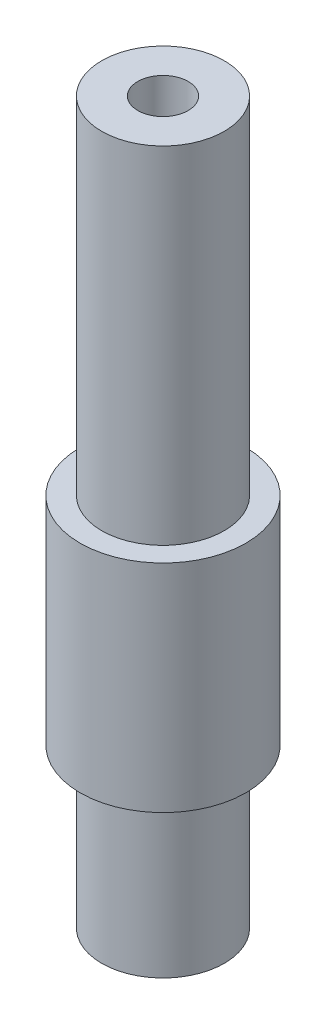
ISO-10303-21;
HEADER;
FILE_DESCRIPTION(('STEP AP214'),'2;1');
FILE_NAME('part.step','',(''),(''),'','','');
FILE_SCHEMA(('AUTOMOTIVE_DESIGN { 1 0 10303 214 1 1 1 1 }'));
ENDSEC;
DATA;
#1=APPLICATION_CONTEXT('core data for automotive mechanical design processes');
#2=APPLICATION_PROTOCOL_DEFINITION('international standard','automotive_design',2000,#1);
#3=PRODUCT_CONTEXT('',#1,'mechanical');
#4=PRODUCT('Part','Part','',(#3));
#5=PRODUCT_RELATED_PRODUCT_CATEGORY('part','',(#4));
#6=PRODUCT_DEFINITION_FORMATION('','',#4);
#7=PRODUCT_DEFINITION_CONTEXT('part definition',#1,'design');
#8=PRODUCT_DEFINITION('design','',#6,#7);
#9=PRODUCT_DEFINITION_SHAPE('','',#8);
#10=(LENGTH_UNIT() NAMED_UNIT(*) SI_UNIT(.MILLI.,.METRE.));
#11=(NAMED_UNIT(*) PLANE_ANGLE_UNIT() SI_UNIT($,.RADIAN.));
#12=(NAMED_UNIT(*) SI_UNIT($,.STERADIAN.) SOLID_ANGLE_UNIT());
#13=UNCERTAINTY_MEASURE_WITH_UNIT(LENGTH_MEASURE(1.E-05),#10,'distance_accuracy_value','');
#14=(GEOMETRIC_REPRESENTATION_CONTEXT(3) GLOBAL_UNCERTAINTY_ASSIGNED_CONTEXT((#13)) GLOBAL_UNIT_ASSIGNED_CONTEXT((#10,
#11,#12)) REPRESENTATION_CONTEXT('',''));
#15=CARTESIAN_POINT('',(0.,0.,0.));
#16=DIRECTION('',(0.,0.,1.));
#17=DIRECTION('',(1.,0.,0.));
#18=AXIS2_PLACEMENT_3D('',#15,#16,#17);
#19=CARTESIAN_POINT('',(0.,22.,0.));
#20=DIRECTION('',(0.,-1.,0.));
#21=DIRECTION('',(0.,0.,-1.));
#22=AXIS2_PLACEMENT_3D('',#19,#20,#21);
#23=CYLINDRICAL_SURFACE('',#22,8.5);
#24=DIRECTION('',(0.,-1.,0.));
#25=VECTOR('',#24,1.);
#26=CARTESIAN_POINT('',(-8.12403840463596,22.,-2.5));
#27=LINE('',#26,#25);
#28=CARTESIAN_POINT('',(-8.12403840463596,4.5,-2.5));
#29=VERTEX_POINT('',#28);
#30=CARTESIAN_POINT('',(-8.12403840463596,17.5,-2.5));
#31=VERTEX_POINT('',#30);
#32=EDGE_CURVE('E197',#29,#31,#27,.F.);
#33=ORIENTED_EDGE('',*,*,#32,.T.);
#34=CARTESIAN_POINT('',(-8.12403840463596,17.5,-2.5));
#35=CARTESIAN_POINT('',(-8.12402906918787,17.5686798740165,-2.50000849482375));
#36=CARTESIAN_POINT('',(-8.12490911076693,17.6373543550343,-2.49717000278527));
#37=CARTESIAN_POINT('',(-8.12837858671625,17.7741805441501,-2.48586511968106));
#38=CARTESIAN_POINT('',(-8.13096764928694,17.8423323626925,-2.47739995270244));
#39=CARTESIAN_POINT('',(-8.13777747849977,17.9774651852461,-2.4549353972169));
#40=CARTESIAN_POINT('',(-8.14199421689239,18.0444486563169,-2.44094966934028));
#41=CARTESIAN_POINT('',(-8.15192355487623,18.1769261224907,-2.40758038109888));
#42=CARTESIAN_POINT('',(-8.15763619117327,18.2424200810019,-2.38819668828));
#43=CARTESIAN_POINT('',(-8.17677139859334,18.4359466577163,-2.32218333516284));
#44=CARTESIAN_POINT('',(-8.19220032894025,18.5611911443731,-2.26766331260792));
#45=CARTESIAN_POINT('',(-8.22665400749432,18.8007525002289,-2.13928827038699));
#46=CARTESIAN_POINT('',(-8.24568033865688,18.9150645253734,-2.06542473351158));
#47=CARTESIAN_POINT('',(-8.28582980304436,19.1330227536414,-1.89805567552886));
#48=CARTESIAN_POINT('',(-8.30699606932741,19.2362914557573,-1.80406793699746));
#49=CARTESIAN_POINT('',(-8.3486723067775,19.4258512308676,-1.60015164255654));
#50=CARTESIAN_POINT('',(-8.36918216745792,19.5121394581522,-1.49022042007659));
#51=CARTESIAN_POINT('',(-8.40772509439061,19.6669298144631,-1.25484557022574));
#52=CARTESIAN_POINT('',(-8.4257010652051,19.735045858621,-1.12913784642324));
#53=CARTESIAN_POINT('',(-8.45664705558546,19.8490219915755,-0.867439712870043));
#54=CARTESIAN_POINT('',(-8.46961832661638,19.8948876449987,-0.731451883926505));
#55=CARTESIAN_POINT('',(-8.48878775104764,19.9618125975809,-0.457025436042512));
#56=CARTESIAN_POINT('',(-8.49516267663223,19.9835205659233,-0.318757581047491));
#57=CARTESIAN_POINT('',(-8.50104290465192,20.0035631669422,-0.0404023337326088));
#58=CARTESIAN_POINT('',(-8.50054945212903,20.0019020357725,0.0996847242177954));
#59=CARTESIAN_POINT('',(-8.49287404903277,19.9756920726157,0.373152065700694));
#60=CARTESIAN_POINT('',(-8.48589741931878,19.9518458124474,0.506606351501283));
#61=CARTESIAN_POINT('',(-8.46628787386658,19.8830881283723,0.767526211609395));
#62=CARTESIAN_POINT('',(-8.45365466599277,19.8381756164872,0.894991476236478));
#63=CARTESIAN_POINT('',(-8.42386367197651,19.7280728830861,1.14201050505989));
#64=CARTESIAN_POINT('',(-8.40665607251673,19.6626579008713,1.26145783196648));
#65=CARTESIAN_POINT('',(-8.36954730631605,19.5135844050676,1.48790576816497));
#66=CARTESIAN_POINT('',(-8.34964555974157,19.4299219618899,1.59490368885599));
#67=CARTESIAN_POINT('',(-8.3084133766687,19.2430791868332,1.79760092163622));
#68=CARTESIAN_POINT('',(-8.28705732485783,19.1392910095942,1.89273539157048));
#69=CARTESIAN_POINT('',(-8.24596689824959,18.9169959430954,2.06442395091056));
#70=CARTESIAN_POINT('',(-8.22623299169098,18.798484828619,2.14097268784054));
#71=CARTESIAN_POINT('',(-8.19049726651393,18.5486482102345,2.27388499803613));
#72=CARTESIAN_POINT('',(-8.17453234339792,18.4172125416657,2.33005169701786));
#73=CARTESIAN_POINT('',(-8.14859211524143,18.1462427316992,2.41922275200857));
#74=CARTESIAN_POINT('',(-8.13860768891974,18.0067212808269,2.45226239378342));
#75=CARTESIAN_POINT('',(-8.1295316440969,17.8049224206918,2.48209216527632));
#76=CARTESIAN_POINT('',(-8.12747604590249,17.7441046608776,2.48880708529662));
#77=CARTESIAN_POINT('',(-8.12472934803225,17.6222014669268,2.49775684694221));
#78=CARTESIAN_POINT('',(-8.1240362093203,17.5611165701191,2.49999838344215));
#79=CARTESIAN_POINT('',(-8.12403840463596,17.5,2.5));
#80=B_SPLINE_CURVE_WITH_KNOTS('',3,(#34,#35,#36,#37,#38,#39,#40,#41,#42,#43,#44,#45,#46,#47,#48,
#49,#50,#51,#52,#53,#54,#55,#56,#57,#58,#59,#60,#61,#62,#63,#64,#65,#66,#67,#68,#69,#70,#71,#72,
#73,#74,#75,#76,#77,#78,#79),.UNSPECIFIED.,.F.,.F.,(4,2,2,2,2,2,2,2,2,2,2,2,2,2,2,2,2,2,2,2,2,2,
4),(0.,0.205966154303657,0.411887515184553,0.617302486138776,0.822722497965398,1.23305966556147,
1.64357781480005,2.06533049675579,2.48715379896952,2.91733102657663,3.3474006151165,
3.76562050724646,4.18376458896796,4.58910158908382,4.99445952536039,5.40442657694558,
5.81448200221468,6.23971616695719,6.66507264934228,7.09443475825321,7.52314033790764,
7.70665727258006,7.88989934885715),.UNSPECIFIED.);
#81=CARTESIAN_POINT('',(-8.12403840463596,17.5,2.5));
#82=VERTEX_POINT('',#81);
#83=EDGE_CURVE('E217',#31,#82,#80,.T.);
#84=ORIENTED_EDGE('',*,*,#83,.T.);
#85=DIRECTION('',(0.,-1.,0.));
#86=VECTOR('',#85,1.);
#87=CARTESIAN_POINT('',(-8.12403840463596,22.,2.5));
#88=LINE('',#87,#86);
#89=CARTESIAN_POINT('',(-8.12403840463596,4.5,2.5));
#90=VERTEX_POINT('',#89);
#91=EDGE_CURVE('E175',#82,#90,#88,.T.);
#92=ORIENTED_EDGE('',*,*,#91,.T.);
#93=CARTESIAN_POINT('',(-8.12403840463596,4.5,2.5));
#94=CARTESIAN_POINT('',(-8.12402906918787,4.43132012598351,2.50000849482375));
#95=CARTESIAN_POINT('',(-8.12490911076693,4.36264564496574,2.49717000278527));
#96=CARTESIAN_POINT('',(-8.12837858671625,4.22581945584985,2.48586511968106));
#97=CARTESIAN_POINT('',(-8.13096764928694,4.15766763730745,2.47739995270243));
#98=CARTESIAN_POINT('',(-8.13777747849977,4.02253481475384,2.4549353972169));
#99=CARTESIAN_POINT('',(-8.14199421689239,3.95555134368311,2.44094966934028));
#100=CARTESIAN_POINT('',(-8.15192355487623,3.82307387750925,2.40758038109888));
#101=CARTESIAN_POINT('',(-8.15763619117327,3.75757991899812,2.38819668828));
#102=CARTESIAN_POINT('',(-8.17677139859334,3.56405334228369,2.32218333516283));
#103=CARTESIAN_POINT('',(-8.19220032894026,3.43880885562689,2.26766331260791));
#104=CARTESIAN_POINT('',(-8.22665400749432,3.19924749977114,2.13928827038699));
#105=CARTESIAN_POINT('',(-8.24568033865688,3.08493547462655,2.06542473351158));
#106=CARTESIAN_POINT('',(-8.28582980304436,2.86697724635863,1.89805567552886));
#107=CARTESIAN_POINT('',(-8.30699606932741,2.76370854424266,1.80406793699746));
#108=CARTESIAN_POINT('',(-8.3486723067775,2.57414876913239,1.60015164255654));
#109=CARTESIAN_POINT('',(-8.36918216745792,2.4878605418478,1.49022042007658));
#110=CARTESIAN_POINT('',(-8.40772509439061,2.33307018553694,1.25484557022573));
#111=CARTESIAN_POINT('',(-8.4257010652051,2.26495414137895,1.12913784642324));
#112=CARTESIAN_POINT('',(-8.45664705558546,2.15097800842445,0.867439712870039));
#113=CARTESIAN_POINT('',(-8.46961832661638,2.10511235500126,0.731451883926502));
#114=CARTESIAN_POINT('',(-8.48878775104765,2.03818740241911,0.45702543604251));
#115=CARTESIAN_POINT('',(-8.49516267663223,2.01647943407666,0.318757581047488));
#116=CARTESIAN_POINT('',(-8.50104290465192,1.99643683305777,0.040402333732606));
#117=CARTESIAN_POINT('',(-8.50054945212903,1.99809796422748,-0.0996847242177983));
#118=CARTESIAN_POINT('',(-8.49287404903277,2.02430792738427,-0.373152065700697));
#119=CARTESIAN_POINT('',(-8.48589741931878,2.04815418755256,-0.506606351501286));
#120=CARTESIAN_POINT('',(-8.46628787386658,2.11691187162767,-0.767526211609398));
#121=CARTESIAN_POINT('',(-8.45365466599277,2.1618243835128,-0.894991476236481));
#122=CARTESIAN_POINT('',(-8.42386367197651,2.2719271169139,-1.14201050505989));
#123=CARTESIAN_POINT('',(-8.40665607251673,2.33734209912869,-1.26145783196649));
#124=CARTESIAN_POINT('',(-8.36954730631605,2.48641559493242,-1.48790576816497));
#125=CARTESIAN_POINT('',(-8.34964555974157,2.57007803811012,-1.59490368885599));
#126=CARTESIAN_POINT('',(-8.3084133766687,2.75692081316677,-1.79760092163623));
#127=CARTESIAN_POINT('',(-8.28705732485783,2.86070899040578,-1.89273539157049));
#128=CARTESIAN_POINT('',(-8.24596689824959,3.08300405690464,-2.06442395091057));
#129=CARTESIAN_POINT('',(-8.22623299169098,3.20151517138103,-2.14097268784054));
#130=CARTESIAN_POINT('',(-8.19049726651393,3.45135178976552,-2.27388499803613));
#131=CARTESIAN_POINT('',(-8.17453234339792,3.5827874583343,-2.33005169701786));
#132=CARTESIAN_POINT('',(-8.14859211524143,3.85375726830082,-2.41922275200858));
#133=CARTESIAN_POINT('',(-8.13860768891974,3.99327871917307,-2.45226239378342));
#134=CARTESIAN_POINT('',(-8.1295316440969,4.19507757930823,-2.48209216527632));
#135=CARTESIAN_POINT('',(-8.12747604590249,4.25589533912244,-2.48880708529662));
#136=CARTESIAN_POINT('',(-8.12472934803225,4.37779853307323,-2.49775684694221));
#137=CARTESIAN_POINT('',(-8.1240362093203,4.43888342988087,-2.49999838344215));
#138=CARTESIAN_POINT('',(-8.12403840463596,4.5,-2.5));
#139=B_SPLINE_CURVE_WITH_KNOTS('',3,(#93,#94,#95,#96,#97,#98,#99,#100,#101,#102,#103,#104,#105,
#106,#107,#108,#109,#110,#111,#112,#113,#114,#115,#116,#117,#118,#119,#120,#121,#122,#123,#124,
#125,#126,#127,#128,#129,#130,#131,#132,#133,#134,#135,#136,#137,#138),.UNSPECIFIED.,.F.,.F.,(4,
2,2,2,2,2,2,2,2,2,2,2,2,2,2,2,2,2,2,2,2,2,4),(0.,0.205966154303658,0.411887515184554,
0.61730248613878,0.822722497965401,1.23305966556148,1.64357781480005,2.0653304967558,
2.48715379896953,2.91733102657664,3.3474006151165,3.76562050724646,4.18376458896797,
4.58910158908383,4.9944595253604,5.40442657694558,5.81448200221468,6.2397161669572,
6.66507264934228,7.09443475825321,7.52314033790764,7.70665727258006,7.88989934885714),.UNSPECIFIED.);
#140=EDGE_CURVE('E189',#90,#29,#139,.T.);
#141=ORIENTED_EDGE('',*,*,#140,.T.);
#142=EDGE_LOOP('',(#33,#84,#92,#141));
#143=FACE_BOUND('',#142,.T.);
#144=CARTESIAN_POINT('',(0.,22.,0.));
#145=DIRECTION('',(0.,1.,0.));
#146=DIRECTION('',(0.,0.,1.));
#147=AXIS2_PLACEMENT_3D('',#144,#145,#146);
#148=CIRCLE('',#147,8.5);
#149=CARTESIAN_POINT('',(0.,22.,8.5));
#150=VERTEX_POINT('',#149);
#151=EDGE_CURVE('E176',#150,#150,#148,.T.);
#152=ORIENTED_EDGE('',*,*,#151,.F.);
#153=EDGE_LOOP('',(#152));
#154=FACE_BOUND('',#153,.T.);
#155=CARTESIAN_POINT('',(0.,0.,0.));
#156=DIRECTION('',(0.,1.,0.));
#157=DIRECTION('',(0.,0.,1.));
#158=AXIS2_PLACEMENT_3D('',#155,#156,#157);
#159=CIRCLE('',#158,8.5);
#160=CARTESIAN_POINT('',(0.,0.,8.5));
#161=VERTEX_POINT('',#160);
#162=EDGE_CURVE('E180',#161,#161,#159,.T.);
#163=ORIENTED_EDGE('',*,*,#162,.T.);
#164=EDGE_LOOP('',(#163));
#165=FACE_BOUND('',#164,.T.);
#166=ADVANCED_FACE('F45',(#143,#154,#165),#23,.T.);
#167=CARTESIAN_POINT('',(0.,0.,0.));
#168=DIRECTION('',(0.,1.,0.));
#169=DIRECTION('',(0.,0.,1.));
#170=AXIS2_PLACEMENT_3D('',#167,#168,#169);
#171=PLANE('',#170);
#172=ORIENTED_EDGE('',*,*,#162,.F.);
#173=EDGE_LOOP('',(#172));
#174=FACE_BOUND('',#173,.T.);
#175=ADVANCED_FACE('F258',(#174),#171,.F.);
#176=CARTESIAN_POINT('',(0.,52.,0.));
#177=DIRECTION('',(0.,-1.,0.));
#178=DIRECTION('',(0.,0.,-1.));
#179=AXIS2_PLACEMENT_3D('',#176,#177,#178);
#180=CYLINDRICAL_SURFACE('',#179,11.5);
#181=CARTESIAN_POINT('',(0.,52.,0.));
#182=DIRECTION('',(0.,1.,0.));
#183=DIRECTION('',(0.,0.,1.));
#184=AXIS2_PLACEMENT_3D('',#181,#182,#183);
#185=CIRCLE('',#184,11.5);
#186=CARTESIAN_POINT('',(0.,52.,11.5));
#187=VERTEX_POINT('',#186);
#188=EDGE_CURVE('E177',#187,#187,#185,.T.);
#189=ORIENTED_EDGE('',*,*,#188,.F.);
#190=EDGE_LOOP('',(#189));
#191=FACE_BOUND('',#190,.T.);
#192=CARTESIAN_POINT('',(0.,22.,0.));
#193=DIRECTION('',(0.,1.,0.));
#194=DIRECTION('',(0.,0.,1.));
#195=AXIS2_PLACEMENT_3D('',#192,#193,#194);
#196=CIRCLE('',#195,11.5);
#197=CARTESIAN_POINT('',(0.,22.,11.5));
#198=VERTEX_POINT('',#197);
#199=EDGE_CURVE('E171',#198,#198,#196,.T.);
#200=ORIENTED_EDGE('',*,*,#199,.T.);
#201=EDGE_LOOP('',(#200));
#202=FACE_BOUND('',#201,.T.);
#203=ADVANCED_FACE('F264',(#191,#202),#180,.T.);
#204=CARTESIAN_POINT('',(0.,52.,0.));
#205=DIRECTION('',(0.,1.,0.));
#206=DIRECTION('',(0.,0.,1.));
#207=AXIS2_PLACEMENT_3D('',#204,#205,#206);
#208=PLANE('',#207);
#209=CARTESIAN_POINT('',(0.,52.,0.));
#210=DIRECTION('',(0.,1.,0.));
#211=DIRECTION('',(0.,0.,1.));
#212=AXIS2_PLACEMENT_3D('',#209,#210,#211);
#213=CIRCLE('',#212,8.5);
#214=CARTESIAN_POINT('',(0.,52.,8.5));
#215=VERTEX_POINT('',#214);
#216=EDGE_CURVE('E172',#215,#215,#213,.T.);
#217=ORIENTED_EDGE('',*,*,#216,.F.);
#218=EDGE_LOOP('',(#217));
#219=FACE_BOUND('',#218,.T.);
#220=ORIENTED_EDGE('',*,*,#188,.T.);
#221=EDGE_LOOP('',(#220));
#222=FACE_BOUND('',#221,.T.);
#223=ADVANCED_FACE('F275',(#219,#222),#208,.T.);
#224=CARTESIAN_POINT('',(0.,22.,0.));
#225=DIRECTION('',(0.,1.,0.));
#226=DIRECTION('',(0.,0.,1.));
#227=AXIS2_PLACEMENT_3D('',#224,#225,#226);
#228=PLANE('',#227);
#229=ORIENTED_EDGE('',*,*,#151,.T.);
#230=EDGE_LOOP('',(#229));
#231=FACE_BOUND('',#230,.T.);
#232=ORIENTED_EDGE('',*,*,#199,.F.);
#233=EDGE_LOOP('',(#232));
#234=FACE_BOUND('',#233,.T.);
#235=ADVANCED_FACE('F272',(#231,#234),#228,.F.);
#236=CARTESIAN_POINT('',(0.,100.,0.));
#237=DIRECTION('',(0.,-1.,0.));
#238=DIRECTION('',(0.,0.,-1.));
#239=AXIS2_PLACEMENT_3D('',#236,#237,#238);
#240=CYLINDRICAL_SURFACE('',#239,8.5);
#241=DIRECTION('',(0.,-1.,0.));
#242=VECTOR('',#241,1.);
#243=CARTESIAN_POINT('',(-8.12403840463596,100.,-2.5));
#244=LINE('',#243,#242);
#245=CARTESIAN_POINT('',(-8.12403840463596,87.133575025702,-2.5));
#246=VERTEX_POINT('',#245);
#247=CARTESIAN_POINT('',(-8.12403840463596,96.,-2.5));
#248=VERTEX_POINT('',#247);
#249=EDGE_CURVE('E59',#246,#248,#244,.F.);
#250=ORIENTED_EDGE('',*,*,#249,.T.);
#251=CARTESIAN_POINT('',(-8.12403840463596,96.,-2.5));
#252=CARTESIAN_POINT('',(-8.12402906918787,96.0686798740165,-2.50000849482375));
#253=CARTESIAN_POINT('',(-8.12490911076693,96.1373543550343,-2.49717000278527));
#254=CARTESIAN_POINT('',(-8.12837858671624,96.2741805441502,-2.48586511968106));
#255=CARTESIAN_POINT('',(-8.13096764928693,96.3423323626926,-2.47739995270244));
#256=CARTESIAN_POINT('',(-8.13777747849977,96.4774651852462,-2.45493539721691));
#257=CARTESIAN_POINT('',(-8.14199421689239,96.5444486563169,-2.44094966934028));
#258=CARTESIAN_POINT('',(-8.15192355487623,96.6769261224908,-2.40758038109888));
#259=CARTESIAN_POINT('',(-8.15763619117327,96.7424200810019,-2.38819668828));
#260=CARTESIAN_POINT('',(-8.17677139859334,96.9359466577163,-2.32218333516283));
#261=CARTESIAN_POINT('',(-8.19220032894025,97.0611911443731,-2.26766331260792));
#262=CARTESIAN_POINT('',(-8.22665400749432,97.3007525002289,-2.13928827038699));
#263=CARTESIAN_POINT('',(-8.24568033865688,97.4150645253735,-2.06542473351158));
#264=CARTESIAN_POINT('',(-8.28582980304435,97.6330227536414,-1.89805567552886));
#265=CARTESIAN_POINT('',(-8.30699606932741,97.7362914557573,-1.80406793699747));
#266=CARTESIAN_POINT('',(-8.34867230677749,97.9258512308676,-1.60015164255655));
#267=CARTESIAN_POINT('',(-8.36918216745792,98.0121394581522,-1.49022042007659));
#268=CARTESIAN_POINT('',(-8.40772509439061,98.1669298144631,-1.25484557022574));
#269=CARTESIAN_POINT('',(-8.4257010652051,98.235045858621,-1.12913784642324));
#270=CARTESIAN_POINT('',(-8.45664705558546,98.3490219915756,-0.867439712870043));
#271=CARTESIAN_POINT('',(-8.46961832661637,98.3948876449987,-0.731451883926505));
#272=CARTESIAN_POINT('',(-8.48878775104764,98.4618125975809,-0.457025436042512));
#273=CARTESIAN_POINT('',(-8.49516267663223,98.4835205659233,-0.31875758104749));
#274=CARTESIAN_POINT('',(-8.50104290465192,98.5035631669422,-0.0404023337326078));
#275=CARTESIAN_POINT('',(-8.50054945212903,98.5019020357725,0.0996847242177965));
#276=CARTESIAN_POINT('',(-8.49287404903276,98.4756920726157,0.373152065700697));
#277=CARTESIAN_POINT('',(-8.48589741931878,98.4518458124474,0.506606351501287));
#278=CARTESIAN_POINT('',(-8.46628787386658,98.3830881283723,0.7675262116094));
#279=CARTESIAN_POINT('',(-8.45365466599277,98.3381756164872,0.894991476236482));
#280=CARTESIAN_POINT('',(-8.42386367197651,98.2280728830861,1.14201050505989));
#281=CARTESIAN_POINT('',(-8.40665607251673,98.1626579008713,1.26145783196648));
#282=CARTESIAN_POINT('',(-8.36954730631604,98.0135844050676,1.48790576816497));
#283=CARTESIAN_POINT('',(-8.34964555974157,97.9299219618899,1.59490368885599));
#284=CARTESIAN_POINT('',(-8.3084133766687,97.7430791868332,1.79760092163623));
#285=CARTESIAN_POINT('',(-8.28705732485782,97.6392910095942,1.89273539157049));
#286=CARTESIAN_POINT('',(-8.24596689824959,97.4169959430954,2.06442395091057));
#287=CARTESIAN_POINT('',(-8.22623299169097,97.298484828619,2.14097268784055));
#288=CARTESIAN_POINT('',(-8.19049726651393,97.0486482102345,2.27388499803613));
#289=CARTESIAN_POINT('',(-8.17453234339792,96.9172125416657,2.33005169701785));
#290=CARTESIAN_POINT('',(-8.14859211524143,96.6462427316992,2.41922275200857));
#291=CARTESIAN_POINT('',(-8.13860768891974,96.506721280827,2.45226239378341));
#292=CARTESIAN_POINT('',(-8.1295316440969,96.3049224206918,2.48209216527632));
#293=CARTESIAN_POINT('',(-8.12747604590249,96.2441046608776,2.48880708529662));
#294=CARTESIAN_POINT('',(-8.12472934803225,96.1222014669268,2.49775684694221));
#295=CARTESIAN_POINT('',(-8.1240362093203,96.0611165701191,2.49999838344215));
#296=CARTESIAN_POINT('',(-8.12403840463596,96.,2.5));
#297=B_SPLINE_CURVE_WITH_KNOTS('',3,(#251,#252,#253,#254,#255,#256,#257,#258,#259,#260,#261,
#262,#263,#264,#265,#266,#267,#268,#269,#270,#271,#272,#273,#274,#275,#276,#277,#278,#279,#280,
#281,#282,#283,#284,#285,#286,#287,#288,#289,#290,#291,#292,#293,#294,#295,#296),.UNSPECIFIED.,
.F.,.F.,(4,2,2,2,2,2,2,2,2,2,2,2,2,2,2,2,2,2,2,2,2,2,4),(0.,0.205966154303675,0.411887515184557,
0.617302486138783,0.822722497965402,1.23305966556148,1.64357781480005,2.06533049675578,
2.48715379896952,2.91733102657663,3.3474006151165,3.76562050724646,4.18376458896797,
4.58910158908383,4.9944595253604,5.40442657694558,5.81448200221468,6.2397161669572,
6.66507264934229,7.09443475825321,7.52314033790763,7.70665727258008,7.88989934885716),.UNSPECIFIED.);
#298=CARTESIAN_POINT('',(-8.12403840463596,96.,2.5));
#299=VERTEX_POINT('',#298);
#300=EDGE_CURVE('E11',#248,#299,#297,.T.);
#301=ORIENTED_EDGE('',*,*,#300,.T.);
#302=DIRECTION('',(0.,-1.,0.));
#303=VECTOR('',#302,1.);
#304=CARTESIAN_POINT('',(-8.12403840463596,100.,2.5));
#305=LINE('',#304,#303);
#306=CARTESIAN_POINT('',(-8.12403840463596,87.133575025702,2.5));
#307=VERTEX_POINT('',#306);
#308=EDGE_CURVE('E224',#299,#307,#305,.T.);
#309=ORIENTED_EDGE('',*,*,#308,.T.);
#310=CARTESIAN_POINT('',(-8.12403840463596,87.133575025702,2.5));
#311=CARTESIAN_POINT('',(-8.12402906918787,87.0648951516855,2.50000849482375));
#312=CARTESIAN_POINT('',(-8.12490911076693,86.9962206706677,2.49717000278527));
#313=CARTESIAN_POINT('',(-8.12837858671624,86.8593944815518,2.48586511968106));
#314=CARTESIAN_POINT('',(-8.13096764928693,86.7912426630094,2.47739995270244));
#315=CARTESIAN_POINT('',(-8.13777747849977,86.6561098404558,2.45493539721691));
#316=CARTESIAN_POINT('',(-8.14199421689239,86.5891263693851,2.44094966934028));
#317=CARTESIAN_POINT('',(-8.15192355487623,86.4566489032112,2.40758038109888));
#318=CARTESIAN_POINT('',(-8.15763619117327,86.3911549447001,2.38819668828));
#319=CARTESIAN_POINT('',(-8.17677139859334,86.1976283679856,2.32218333516283));
#320=CARTESIAN_POINT('',(-8.19220032894025,86.0723838813289,2.26766331260792));
#321=CARTESIAN_POINT('',(-8.22665400749432,85.8328225254731,2.13928827038699));
#322=CARTESIAN_POINT('',(-8.24568033865688,85.7185105003285,2.06542473351158));
#323=CARTESIAN_POINT('',(-8.28582980304435,85.5005522720606,1.89805567552886));
#324=CARTESIAN_POINT('',(-8.30699606932741,85.3972835699446,1.80406793699746));
#325=CARTESIAN_POINT('',(-8.3486723067775,85.2077237948344,1.60015164255654));
#326=CARTESIAN_POINT('',(-8.36918216745792,85.1214355675498,1.49022042007659));
#327=CARTESIAN_POINT('',(-8.40772509439061,84.9666452112389,1.25484557022574));
#328=CARTESIAN_POINT('',(-8.4257010652051,84.8985291670809,1.12913784642324));
#329=CARTESIAN_POINT('',(-8.45664705558546,84.7845530341264,0.867439712870043));
#330=CARTESIAN_POINT('',(-8.46961832661637,84.7386873807032,0.731451883926505));
#331=CARTESIAN_POINT('',(-8.48878775104764,84.6717624281211,0.457025436042512));
#332=CARTESIAN_POINT('',(-8.49516267663223,84.6500544597786,0.318757581047491));
#333=CARTESIAN_POINT('',(-8.50104290465192,84.6300118587597,0.0404023337326082));
#334=CARTESIAN_POINT('',(-8.50054945212903,84.6316729899295,-0.0996847242177962));
#335=CARTESIAN_POINT('',(-8.49287404903276,84.6578829530862,-0.373152065700697));
#336=CARTESIAN_POINT('',(-8.48589741931878,84.6817292132545,-0.506606351501287));
#337=CARTESIAN_POINT('',(-8.46628787386658,84.7504868973296,-0.7675262116094));
#338=CARTESIAN_POINT('',(-8.45365466599277,84.7953994092148,-0.894991476236482));
#339=CARTESIAN_POINT('',(-8.42386367197651,84.9055021426159,-1.14201050505989));
#340=CARTESIAN_POINT('',(-8.40665607251673,84.9709171248306,-1.26145783196649));
#341=CARTESIAN_POINT('',(-8.36954730631604,85.1199906206344,-1.48790576816497));
#342=CARTESIAN_POINT('',(-8.34964555974157,85.2036530638121,-1.59490368885599));
#343=CARTESIAN_POINT('',(-8.3084133766687,85.3904958388687,-1.79760092163623));
#344=CARTESIAN_POINT('',(-8.28705732485782,85.4942840161077,-1.89273539157049));
#345=CARTESIAN_POINT('',(-8.24596689824959,85.7165790826066,-2.06442395091057));
#346=CARTESIAN_POINT('',(-8.22623299169097,85.835090197083,-2.14097268784055));
#347=CARTESIAN_POINT('',(-8.19049726651393,86.0849268154675,-2.27388499803613));
#348=CARTESIAN_POINT('',(-8.17453234339792,86.2163624840363,-2.33005169701786));
#349=CARTESIAN_POINT('',(-8.14859211524142,86.4873322940028,-2.41922275200858));
#350=CARTESIAN_POINT('',(-8.13860768891974,86.626853744875,-2.45226239378341));
#351=CARTESIAN_POINT('',(-8.1295316440969,86.8286526050102,-2.48209216527632));
#352=CARTESIAN_POINT('',(-8.12747604590249,86.8894703648244,-2.48880708529662));
#353=CARTESIAN_POINT('',(-8.12472934803225,87.0113735587752,-2.49775684694221));
#354=CARTESIAN_POINT('',(-8.1240362093203,87.0724584555828,-2.49999838344215));
#355=CARTESIAN_POINT('',(-8.12403840463596,87.133575025702,-2.5));
#356=B_SPLINE_CURVE_WITH_KNOTS('',3,(#310,#311,#312,#313,#314,#315,#316,#317,#318,#319,#320,
#321,#322,#323,#324,#325,#326,#327,#328,#329,#330,#331,#332,#333,#334,#335,#336,#337,#338,#339,
#340,#341,#342,#343,#344,#345,#346,#347,#348,#349,#350,#351,#352,#353,#354,#355),.UNSPECIFIED.,
.F.,.F.,(4,2,2,2,2,2,2,2,2,2,2,2,2,2,2,2,2,2,2,2,2,2,4),(0.,0.205966154303675,0.411887515184557,
0.617302486138783,0.822722497965402,1.23305966556148,1.64357781480005,2.06533049675579,
2.48715379896952,2.91733102657663,3.3474006151165,3.76562050724646,4.18376458896797,
4.58910158908383,4.9944595253604,5.40442657694558,5.81448200221468,6.2397161669572,
6.66507264934229,7.09443475825322,7.52314033790764,7.70665727258006,7.88989934885716),.UNSPECIFIED.);
#357=EDGE_CURVE('E227',#307,#246,#356,.T.);
#358=ORIENTED_EDGE('',*,*,#357,.T.);
#359=EDGE_LOOP('',(#250,#301,#309,#358));
#360=FACE_BOUND('',#359,.T.);
#361=CARTESIAN_POINT('',(0.,100.,0.));
#362=DIRECTION('',(0.,1.,0.));
#363=DIRECTION('',(0.,0.,1.));
#364=AXIS2_PLACEMENT_3D('',#361,#362,#363);
#365=CIRCLE('',#364,8.5);
#366=CARTESIAN_POINT('',(0.,100.,8.5));
#367=VERTEX_POINT('',#366);
#368=EDGE_CURVE('E164',#367,#367,#365,.T.);
#369=ORIENTED_EDGE('',*,*,#368,.F.);
#370=EDGE_LOOP('',(#369));
#371=FACE_BOUND('',#370,.T.);
#372=ORIENTED_EDGE('',*,*,#216,.T.);
#373=EDGE_LOOP('',(#372));
#374=FACE_BOUND('',#373,.T.);
#375=ADVANCED_FACE('F234',(#360,#371,#374),#240,.T.);
#376=CARTESIAN_POINT('',(0.,100.,0.));
#377=DIRECTION('',(0.,1.,0.));
#378=DIRECTION('',(0.,0.,1.));
#379=AXIS2_PLACEMENT_3D('',#376,#377,#378);
#380=PLANE('',#379);
#381=CARTESIAN_POINT('',(0.,100.,0.));
#382=DIRECTION('',(0.,1.,0.));
#383=DIRECTION('',(0.,0.,1.));
#384=AXIS2_PLACEMENT_3D('',#381,#382,#383);
#385=CIRCLE('',#384,3.49999999999999);
#386=CARTESIAN_POINT('',(0.,100.,3.49999999999999));
#387=VERTEX_POINT('',#386);
#388=EDGE_CURVE('E128',#387,#387,#385,.T.);
#389=ORIENTED_EDGE('',*,*,#388,.F.);
#390=EDGE_LOOP('',(#389));
#391=FACE_BOUND('',#390,.T.);
#392=ORIENTED_EDGE('',*,*,#368,.T.);
#393=EDGE_LOOP('',(#392));
#394=FACE_BOUND('',#393,.T.);
#395=ADVANCED_FACE('F215',(#391,#394),#380,.T.);
#396=CARTESIAN_POINT('',(-53.5,17.5,0.));
#397=DIRECTION('',(1.,0.,0.));
#398=DIRECTION('',(0.,0.,-1.));
#399=AXIS2_PLACEMENT_3D('',#396,#397,#398);
#400=CYLINDRICAL_SURFACE('',#399,2.5);
#401=DIRECTION('',(1.,0.,0.));
#402=VECTOR('',#401,1.);
#403=CARTESIAN_POINT('',(-53.5,17.5,-2.5));
#404=LINE('',#403,#402);
#405=CARTESIAN_POINT('',(-5.5,17.5,-2.5));
#406=VERTEX_POINT('',#405);
#407=EDGE_CURVE('E162',#31,#406,#404,.T.);
#408=ORIENTED_EDGE('',*,*,#407,.T.);
#409=CARTESIAN_POINT('',(-5.5,17.5,0.));
#410=DIRECTION('',(1.,0.,0.));
#411=DIRECTION('',(0.,0.,-1.));
#412=AXIS2_PLACEMENT_3D('',#409,#410,#411);
#413=CIRCLE('',#412,2.5);
#414=CARTESIAN_POINT('',(-5.5,17.5,2.5));
#415=VERTEX_POINT('',#414);
#416=EDGE_CURVE('E146',#406,#415,#413,.T.);
#417=ORIENTED_EDGE('',*,*,#416,.T.);
#418=DIRECTION('',(1.,0.,0.));
#419=VECTOR('',#418,1.);
#420=CARTESIAN_POINT('',(-53.5,17.5,2.5));
#421=LINE('',#420,#419);
#422=EDGE_CURVE('E161',#82,#415,#421,.T.);
#423=ORIENTED_EDGE('',*,*,#422,.F.);
#424=ORIENTED_EDGE('',*,*,#83,.F.);
#425=EDGE_LOOP('',(#408,#417,#423,#424));
#426=FACE_BOUND('',#425,.T.);
#427=ADVANCED_FACE('F211',(#426),#400,.F.);
#428=CARTESIAN_POINT('',(-53.5,17.5,-2.5));
#429=DIRECTION('',(0.,0.,-1.));
#430=DIRECTION('',(0.,1.,0.));
#431=AXIS2_PLACEMENT_3D('',#428,#429,#430);
#432=PLANE('',#431);
#433=DIRECTION('',(1.,0.,0.));
#434=VECTOR('',#433,1.);
#435=CARTESIAN_POINT('',(-53.5,4.5,-2.5));
#436=LINE('',#435,#434);
#437=CARTESIAN_POINT('',(-5.5,4.5,-2.5));
#438=VERTEX_POINT('',#437);
#439=EDGE_CURVE('E165',#29,#438,#436,.T.);
#440=ORIENTED_EDGE('',*,*,#439,.T.);
#441=DIRECTION('',(0.,1.,0.));
#442=VECTOR('',#441,1.);
#443=CARTESIAN_POINT('',(-5.5,17.5,-2.5));
#444=LINE('',#443,#442);
#445=EDGE_CURVE('E158',#438,#406,#444,.T.);
#446=ORIENTED_EDGE('',*,*,#445,.T.);
#447=ORIENTED_EDGE('',*,*,#407,.F.);
#448=ORIENTED_EDGE('',*,*,#32,.F.);
#449=EDGE_LOOP('',(#440,#446,#447,#448));
#450=FACE_BOUND('',#449,.T.);
#451=ADVANCED_FACE('F205',(#450),#432,.F.);
#452=CARTESIAN_POINT('',(-53.5,4.5,0.));
#453=DIRECTION('',(1.,0.,0.));
#454=DIRECTION('',(0.,0.,-1.));
#455=AXIS2_PLACEMENT_3D('',#452,#453,#454);
#456=CYLINDRICAL_SURFACE('',#455,2.5);
#457=DIRECTION('',(1.,0.,0.));
#458=VECTOR('',#457,1.);
#459=CARTESIAN_POINT('',(-53.5,4.5,2.5));
#460=LINE('',#459,#458);
#461=CARTESIAN_POINT('',(-5.5,4.5,2.5));
#462=VERTEX_POINT('',#461);
#463=EDGE_CURVE('E74',#90,#462,#460,.T.);
#464=ORIENTED_EDGE('',*,*,#463,.T.);
#465=CARTESIAN_POINT('',(-5.5,4.5,0.));
#466=DIRECTION('',(1.,0.,0.));
#467=DIRECTION('',(0.,0.,-1.));
#468=AXIS2_PLACEMENT_3D('',#465,#466,#467);
#469=CIRCLE('',#468,2.5);
#470=EDGE_CURVE('E155',#462,#438,#469,.T.);
#471=ORIENTED_EDGE('',*,*,#470,.T.);
#472=ORIENTED_EDGE('',*,*,#439,.F.);
#473=ORIENTED_EDGE('',*,*,#140,.F.);
#474=EDGE_LOOP('',(#464,#471,#472,#473));
#475=FACE_BOUND('',#474,.T.);
#476=ADVANCED_FACE('F199',(#475),#456,.F.);
#477=CARTESIAN_POINT('',(-53.5,17.5,2.5));
#478=DIRECTION('',(0.,0.,1.));
#479=DIRECTION('',(0.,-1.,0.));
#480=AXIS2_PLACEMENT_3D('',#477,#478,#479);
#481=PLANE('',#480);
#482=ORIENTED_EDGE('',*,*,#422,.T.);
#483=DIRECTION('',(0.,-1.,0.));
#484=VECTOR('',#483,1.);
#485=CARTESIAN_POINT('',(-5.5,17.5,2.5));
#486=LINE('',#485,#484);
#487=EDGE_CURVE('E153',#415,#462,#486,.T.);
#488=ORIENTED_EDGE('',*,*,#487,.T.);
#489=ORIENTED_EDGE('',*,*,#463,.F.);
#490=ORIENTED_EDGE('',*,*,#91,.F.);
#491=EDGE_LOOP('',(#482,#488,#489,#490));
#492=FACE_BOUND('',#491,.T.);
#493=ADVANCED_FACE('F204',(#492),#481,.F.);
#494=CARTESIAN_POINT('',(-5.5,17.5,0.));
#495=DIRECTION('',(1.,0.,0.));
#496=DIRECTION('',(0.,0.,-1.));
#497=AXIS2_PLACEMENT_3D('',#494,#495,#496);
#498=PLANE('',#497);
#499=ORIENTED_EDGE('',*,*,#416,.F.);
#500=ORIENTED_EDGE('',*,*,#445,.F.);
#501=ORIENTED_EDGE('',*,*,#470,.F.);
#502=ORIENTED_EDGE('',*,*,#487,.F.);
#503=EDGE_LOOP('',(#499,#500,#501,#502));
#504=FACE_BOUND('',#503,.T.);
#505=ADVANCED_FACE('F210',(#504),#498,.F.);
#506=CARTESIAN_POINT('',(-11.,96.,0.));
#507=DIRECTION('',(1.,0.,0.));
#508=DIRECTION('',(0.,0.,-1.));
#509=AXIS2_PLACEMENT_3D('',#506,#507,#508);
#510=CYLINDRICAL_SURFACE('',#509,2.5);
#511=DIRECTION('',(1.,0.,0.));
#512=VECTOR('',#511,1.);
#513=CARTESIAN_POINT('',(-11.,96.,-2.5));
#514=LINE('',#513,#512);
#515=CARTESIAN_POINT('',(-5.5,96.,-2.5));
#516=VERTEX_POINT('',#515);
#517=EDGE_CURVE('E144',#248,#516,#514,.T.);
#518=ORIENTED_EDGE('',*,*,#517,.T.);
#519=CARTESIAN_POINT('',(-5.5,96.,0.));
#520=DIRECTION('',(1.,0.,0.));
#521=DIRECTION('',(0.,0.,-1.));
#522=AXIS2_PLACEMENT_3D('',#519,#520,#521);
#523=CIRCLE('',#522,2.5);
#524=CARTESIAN_POINT('',(-5.5,96.,2.5));
#525=VERTEX_POINT('',#524);
#526=EDGE_CURVE('E127',#516,#525,#523,.T.);
#527=ORIENTED_EDGE('',*,*,#526,.T.);
#528=DIRECTION('',(1.,0.,0.));
#529=VECTOR('',#528,1.);
#530=CARTESIAN_POINT('',(-11.,96.,2.5));
#531=LINE('',#530,#529);
#532=EDGE_CURVE('E143',#299,#525,#531,.T.);
#533=ORIENTED_EDGE('',*,*,#532,.F.);
#534=ORIENTED_EDGE('',*,*,#300,.F.);
#535=EDGE_LOOP('',(#518,#527,#533,#534));
#536=FACE_BOUND('',#535,.T.);
#537=ADVANCED_FACE('F247',(#536),#510,.F.);
#538=CARTESIAN_POINT('',(-11.,96.,-2.5));
#539=DIRECTION('',(0.,0.,-1.));
#540=DIRECTION('',(0.,1.,0.));
#541=AXIS2_PLACEMENT_3D('',#538,#539,#540);
#542=PLANE('',#541);
#543=DIRECTION('',(1.,0.,0.));
#544=VECTOR('',#543,1.);
#545=CARTESIAN_POINT('',(-11.,87.133575025702,-2.5));
#546=LINE('',#545,#544);
#547=CARTESIAN_POINT('',(-5.5,87.133575025702,-2.5));
#548=VERTEX_POINT('',#547);
#549=EDGE_CURVE('E147',#246,#548,#546,.T.);
#550=ORIENTED_EDGE('',*,*,#549,.T.);
#551=DIRECTION('',(0.,1.,0.));
#552=VECTOR('',#551,1.);
#553=CARTESIAN_POINT('',(-5.5,96.,-2.5));
#554=LINE('',#553,#552);
#555=EDGE_CURVE('E140',#548,#516,#554,.T.);
#556=ORIENTED_EDGE('',*,*,#555,.T.);
#557=ORIENTED_EDGE('',*,*,#517,.F.);
#558=ORIENTED_EDGE('',*,*,#249,.F.);
#559=EDGE_LOOP('',(#550,#556,#557,#558));
#560=FACE_BOUND('',#559,.T.);
#561=ADVANCED_FACE('F243',(#560),#542,.F.);
#562=CARTESIAN_POINT('',(-11.,87.133575025702,0.));
#563=DIRECTION('',(1.,0.,0.));
#564=DIRECTION('',(0.,0.,-1.));
#565=AXIS2_PLACEMENT_3D('',#562,#563,#564);
#566=CYLINDRICAL_SURFACE('',#565,2.5);
#567=DIRECTION('',(1.,0.,0.));
#568=VECTOR('',#567,1.);
#569=CARTESIAN_POINT('',(-11.,87.133575025702,2.5));
#570=LINE('',#569,#568);
#571=CARTESIAN_POINT('',(-5.5,87.133575025702,2.5));
#572=VERTEX_POINT('',#571);
#573=EDGE_CURVE('E66',#307,#572,#570,.T.);
#574=ORIENTED_EDGE('',*,*,#573,.T.);
#575=CARTESIAN_POINT('',(-5.5,87.133575025702,0.));
#576=DIRECTION('',(1.,0.,0.));
#577=DIRECTION('',(0.,0.,-1.));
#578=AXIS2_PLACEMENT_3D('',#575,#576,#577);
#579=CIRCLE('',#578,2.5);
#580=EDGE_CURVE('E137',#572,#548,#579,.T.);
#581=ORIENTED_EDGE('',*,*,#580,.T.);
#582=ORIENTED_EDGE('',*,*,#549,.F.);
#583=ORIENTED_EDGE('',*,*,#357,.F.);
#584=EDGE_LOOP('',(#574,#581,#582,#583));
#585=FACE_BOUND('',#584,.T.);
#586=ADVANCED_FACE('F237',(#585),#566,.F.);
#587=CARTESIAN_POINT('',(-11.,96.,2.5));
#588=DIRECTION('',(0.,0.,1.));
#589=DIRECTION('',(0.,-1.,0.));
#590=AXIS2_PLACEMENT_3D('',#587,#588,#589);
#591=PLANE('',#590);
#592=ORIENTED_EDGE('',*,*,#532,.T.);
#593=DIRECTION('',(0.,-1.,0.));
#594=VECTOR('',#593,1.);
#595=CARTESIAN_POINT('',(-5.5,96.,2.5));
#596=LINE('',#595,#594);
#597=EDGE_CURVE('E131',#525,#572,#596,.T.);
#598=ORIENTED_EDGE('',*,*,#597,.T.);
#599=ORIENTED_EDGE('',*,*,#573,.F.);
#600=ORIENTED_EDGE('',*,*,#308,.F.);
#601=EDGE_LOOP('',(#592,#598,#599,#600));
#602=FACE_BOUND('',#601,.T.);
#603=ADVANCED_FACE('F242',(#602),#591,.F.);
#604=CARTESIAN_POINT('',(-5.5,96.,0.));
#605=DIRECTION('',(1.,0.,0.));
#606=DIRECTION('',(0.,0.,-1.));
#607=AXIS2_PLACEMENT_3D('',#604,#605,#606);
#608=PLANE('',#607);
#609=ORIENTED_EDGE('',*,*,#526,.F.);
#610=ORIENTED_EDGE('',*,*,#555,.F.);
#611=ORIENTED_EDGE('',*,*,#580,.F.);
#612=ORIENTED_EDGE('',*,*,#597,.F.);
#613=EDGE_LOOP('',(#609,#610,#611,#612));
#614=FACE_BOUND('',#613,.T.);
#615=ADVANCED_FACE('F121',(#614),#608,.F.);
#616=CARTESIAN_POINT('',(0.,82.,0.));
#617=DIRECTION('',(0.,1.,0.));
#618=DIRECTION('',(0.,0.,1.));
#619=AXIS2_PLACEMENT_3D('',#616,#617,#618);
#620=CONICAL_SURFACE('',#619,3.5,1.02974425867665);
#621=CARTESIAN_POINT('',(0.,79.8969878334035,0.));
#622=VERTEX_POINT('',#621);
#623=VERTEX_LOOP('',#622);
#624=FACE_BOUND('',#623,.T.);
#625=CARTESIAN_POINT('',(0.,82.,0.));
#626=DIRECTION('',(0.,1.,0.));
#627=DIRECTION('',(0.,0.,1.));
#628=AXIS2_PLACEMENT_3D('',#625,#626,#627);
#629=CIRCLE('',#628,3.5);
#630=CARTESIAN_POINT('',(0.,82.,3.5));
#631=VERTEX_POINT('',#630);
#632=EDGE_CURVE('E125',#631,#631,#629,.T.);
#633=ORIENTED_EDGE('',*,*,#632,.T.);
#634=EDGE_LOOP('',(#633));
#635=FACE_BOUND('',#634,.T.);
#636=ADVANCED_FACE('F117',(#624,#635),#620,.F.);
#637=CARTESIAN_POINT('',(0.,100.,0.));
#638=DIRECTION('',(0.,1.,0.));
#639=DIRECTION('',(0.,0.,1.));
#640=AXIS2_PLACEMENT_3D('',#637,#638,#639);
#641=CYLINDRICAL_SURFACE('',#640,3.49999999999999);
#642=ORIENTED_EDGE('',*,*,#632,.F.);
#643=EDGE_LOOP('',(#642));
#644=FACE_BOUND('',#643,.T.);
#645=ORIENTED_EDGE('',*,*,#388,.T.);
#646=EDGE_LOOP('',(#645));
#647=FACE_BOUND('',#646,.T.);
#648=ADVANCED_FACE('F120',(#644,#647),#641,.F.);
#649=CLOSED_SHELL('',(#166,#175,#203,#223,#235,#375,#395,#427,#451,#476,#493,#505,#537,#561,
#586,#603,#615,#636,#648));
#650=MANIFOLD_SOLID_BREP('B2',#649);
#651=ADVANCED_BREP_SHAPE_REPRESENTATION('',(#18,#650),#14);
#652=SHAPE_DEFINITION_REPRESENTATION(#9,#651);
ENDSEC;
END-ISO-10303-21;
